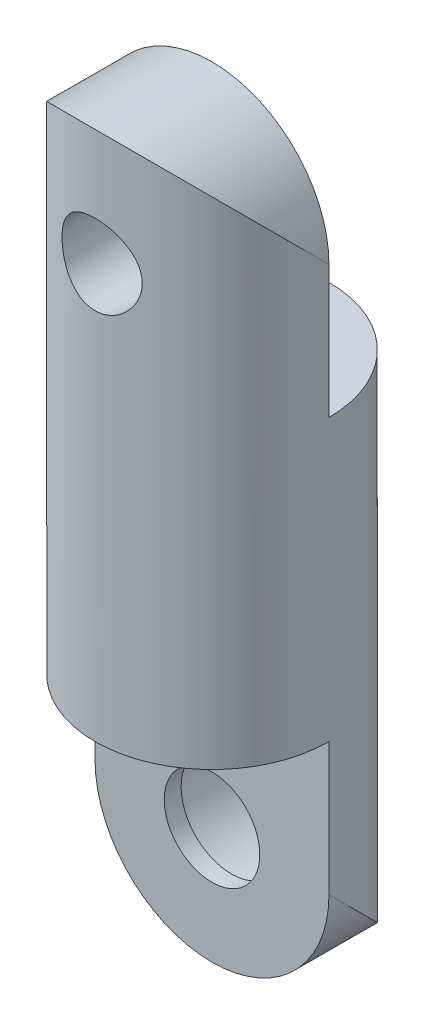
ISO-10303-21;
HEADER;
FILE_DESCRIPTION(('STEP AP214'),'2;1');
FILE_NAME('part.step','',(''),(''),'','','');
FILE_SCHEMA(('AUTOMOTIVE_DESIGN { 1 0 10303 214 1 1 1 1 }'));
ENDSEC;
DATA;
#1=APPLICATION_CONTEXT('core data for automotive mechanical design processes');
#2=APPLICATION_PROTOCOL_DEFINITION('international standard','automotive_design',2000,#1);
#3=PRODUCT_CONTEXT('',#1,'mechanical');
#4=PRODUCT('Part','Part','',(#3));
#5=PRODUCT_RELATED_PRODUCT_CATEGORY('part','',(#4));
#6=PRODUCT_DEFINITION_FORMATION('','',#4);
#7=PRODUCT_DEFINITION_CONTEXT('part definition',#1,'design');
#8=PRODUCT_DEFINITION('design','',#6,#7);
#9=PRODUCT_DEFINITION_SHAPE('','',#8);
#10=(LENGTH_UNIT() NAMED_UNIT(*) SI_UNIT(.MILLI.,.METRE.));
#11=(NAMED_UNIT(*) PLANE_ANGLE_UNIT() SI_UNIT($,.RADIAN.));
#12=(NAMED_UNIT(*) SI_UNIT($,.STERADIAN.) SOLID_ANGLE_UNIT());
#13=UNCERTAINTY_MEASURE_WITH_UNIT(LENGTH_MEASURE(1.E-05),#10,'distance_accuracy_value','');
#14=(GEOMETRIC_REPRESENTATION_CONTEXT(3) GLOBAL_UNCERTAINTY_ASSIGNED_CONTEXT((#13)) GLOBAL_UNIT_ASSIGNED_CONTEXT((#10,
#11,#12)) REPRESENTATION_CONTEXT('',''));
#15=CARTESIAN_POINT('',(0.,0.,0.));
#16=DIRECTION('',(0.,0.,1.));
#17=DIRECTION('',(1.,0.,0.));
#18=AXIS2_PLACEMENT_3D('',#15,#16,#17);
#19=CARTESIAN_POINT('',(0.,63.5,0.));
#20=DIRECTION('',(0.,-1.,0.));
#21=DIRECTION('',(0.,0.,-1.));
#22=AXIS2_PLACEMENT_3D('',#19,#20,#21);
#23=CYLINDRICAL_SURFACE('',#22,9.525);
#24=CARTESIAN_POINT('',(0.,15.748,-9.525));
#25=CARTESIAN_POINT('',(-0.156934723514253,15.7479991634072,-9.52499922257834));
#26=CARTESIAN_POINT('',(-0.313882949789862,15.7420549434146,-9.52111264685008));
#27=CARTESIAN_POINT('',(-0.626511887078806,15.7183670297684,-9.50566210750126));
#28=CARTESIAN_POINT('',(-0.782192454489266,15.7006220176155,-9.49409728599254));
#29=CARTESIAN_POINT('',(-1.09112841711444,15.6535880314441,-9.46357052824237));
#30=CARTESIAN_POINT('',(-1.24438273174379,15.6242940563747,-9.44460538747485));
#31=CARTESIAN_POINT('',(-1.54735001257569,15.5545617962245,-9.39972342238864));
#32=CARTESIAN_POINT('',(-1.69706149182668,15.5141189188937,-9.37380373359864));
#33=CARTESIAN_POINT('',(-1.99115851668002,15.4228466257493,-9.31575307878248));
#34=CARTESIAN_POINT('',(-2.13556770280215,15.3720722959157,-9.28365510171462));
#35=CARTESIAN_POINT('',(-2.41911416643429,15.2605780524269,-9.21384129913733));
#36=CARTESIAN_POINT('',(-2.5582493727651,15.199854280282,-9.17612329464337));
#37=CARTESIAN_POINT('',(-2.96661747883622,15.0036839188896,-9.05566937744821));
#38=CARTESIAN_POINT('',(-3.22707711542841,14.8541550100325,-8.96557934290723));
#39=CARTESIAN_POINT('',(-3.74101098240713,14.5084252718518,-8.7643040390996));
#40=CARTESIAN_POINT('',(-3.99209455918022,14.3093736021146,-8.65198648431073));
#41=CARTESIAN_POINT('',(-4.45971210884856,13.8768116079396,-8.42049031056111));
#42=CARTESIAN_POINT('',(-4.67619690492835,13.6432531283996,-8.30130224772298));
#43=CARTESIAN_POINT('',(-4.98763379665094,13.2509500280644,-8.11583243392666));
#44=CARTESIAN_POINT('',(-5.09517945855456,13.1025073409169,-8.04855916261711));
#45=CARTESIAN_POINT('',(-5.29730188736772,12.7957951855643,-7.91699223664089));
#46=CARTESIAN_POINT('',(-5.39187587796315,12.6375236241926,-7.85269922177893));
#47=CARTESIAN_POINT('',(-5.65476266658884,12.1490660983211,-7.6677885451167));
#48=CARTESIAN_POINT('',(-5.80287157488506,11.8044473666475,-7.55474413148604));
#49=CARTESIAN_POINT('',(-6.003729361554,11.1848899134288,-7.39544695776246));
#50=CARTESIAN_POINT('',(-6.07155948142197,10.9173818806978,-7.33935744261352));
#51=CARTESIAN_POINT('',(-6.14640602970258,10.5082002237448,-7.27655902492335));
#52=CARTESIAN_POINT('',(-6.16686933883874,10.3705354391371,-7.25918452212745));
#53=CARTESIAN_POINT('',(-6.19855823203498,10.0933658972965,-7.23214740414273));
#54=CARTESIAN_POINT('',(-6.20978373836908,9.95386112459224,-7.22248485384154));
#55=CARTESIAN_POINT('',(-6.22281358066484,9.6735816739705,-7.21126115622188));
#56=CARTESIAN_POINT('',(-6.22458381851484,9.53280423136082,-7.2097293304955));
#57=CARTESIAN_POINT('',(-6.218582125865,9.25160721346345,-7.21490658490873));
#58=CARTESIAN_POINT('',(-6.21081015322907,9.11118763975879,-7.22161570143836));
#59=CARTESIAN_POINT('',(-6.18585381246094,8.83172676173245,-7.24300397972116));
#60=CARTESIAN_POINT('',(-6.16866442297574,8.69268623301748,-7.2576873933215));
#61=CARTESIAN_POINT('',(-6.12516074430469,8.41700998095359,-7.29443831953878));
#62=CARTESIAN_POINT('',(-6.09884263564586,8.28037528939513,-7.31650892283388));
#63=CARTESIAN_POINT('',(-6.0090234539764,7.88539472853199,-7.39075079226822));
#64=CARTESIAN_POINT('',(-5.93364207367259,7.63132282626296,-7.45188520582128));
#65=CARTESIAN_POINT('',(-5.75351807229525,7.13928424065651,-7.59181073881822));
#66=CARTESIAN_POINT('',(-5.64876580153466,6.90132288232583,-7.67060765949803));
#67=CARTESIAN_POINT('',(-5.38894697844086,6.39764157228329,-7.85589207158952));
#68=CARTESIAN_POINT('',(-5.22801895491706,6.13579972155227,-7.96477071879505));
#69=CARTESIAN_POINT('',(-4.96030492720383,5.76408443027462,-8.13216860461249));
#70=CARTESIAN_POINT('',(-4.8665879015454,5.64359264084952,-8.18869829644553));
#71=CARTESIAN_POINT('',(-4.67059269595334,5.40983920481505,-8.30204717623972));
#72=CARTESIAN_POINT('',(-4.56831295419478,5.29657888388298,-8.35886641523109));
#73=CARTESIAN_POINT('',(-4.33431796121556,5.0558925588467,-8.48293388471725));
#74=CARTESIAN_POINT('',(-4.20079436332762,4.9301298964019,-8.5500085325601));
#75=CARTESIAN_POINT('',(-3.92238178355393,4.69029295007673,-8.68125692561856));
#76=CARTESIAN_POINT('',(-3.77749639493663,4.57621499691339,-8.74543157794393));
#77=CARTESIAN_POINT('',(-3.476945706779,4.36062595944701,-8.86920920198787));
#78=CARTESIAN_POINT('',(-3.32128647989869,4.25910788430185,-8.92881470980483));
#79=CARTESIAN_POINT('',(-2.9998468094302,4.06959602100861,-9.04187737341704));
#80=CARTESIAN_POINT('',(-2.83406919355426,3.98159847833682,-9.09533623503617));
#81=CARTESIAN_POINT('',(-2.52707571081743,3.83619654502143,-9.18475816224489));
#82=CARTESIAN_POINT('',(-2.38748860975379,3.77618382744373,-9.22209023273268));
#83=CARTESIAN_POINT('',(-2.10307959780248,3.6661586493005,-9.29107527665891));
#84=CARTESIAN_POINT('',(-1.95825873724252,3.61614419526599,-9.32272938204914));
#85=CARTESIAN_POINT('',(-1.66425630974918,3.52670246113572,-9.37967379919022));
#86=CARTESIAN_POINT('',(-1.51507751874074,3.48726859769984,-9.40496806747055));
#87=CARTESIAN_POINT('',(-1.21322375881286,3.41944979727924,-9.44864888363074));
#88=CARTESIAN_POINT('',(-1.06054873029968,3.39106504877649,-9.46703531367264));
#89=CARTESIAN_POINT('',(-0.752206719656679,3.34565618297464,-9.49651968044981));
#90=CARTESIAN_POINT('',(-0.596530449282511,3.32867643073834,-9.5075891518324));
#91=CARTESIAN_POINT('',(-0.283982198418896,3.30650929448325,-9.52205082051723));
#92=CARTESIAN_POINT('',(-0.127110217055839,3.30132191908103,-9.52544301220975));
#93=CARTESIAN_POINT('',(0.186554693179844,3.30282004082096,-9.52446424095804));
#94=CARTESIAN_POINT('',(0.343347620850843,3.30950571329838,-9.5200931633697));
#95=CARTESIAN_POINT('',(0.655574782160458,3.33464606771102,-9.50369862566659));
#96=CARTESIAN_POINT('',(0.81100906143466,3.353100352799,-9.49167542358775));
#97=CARTESIAN_POINT('',(1.10978696110037,3.40000768037505,-9.46124347516521));
#98=CARTESIAN_POINT('',(1.25328417438538,3.42777237175916,-9.44327524069039));
#99=CARTESIAN_POINT('',(1.53714631391083,3.49307210485668,-9.40124644909558));
#100=CARTESIAN_POINT('',(1.67751015350809,3.53061048060765,-9.37718381310589));
#101=CARTESIAN_POINT('',(2.09257281861952,3.65725948574795,-9.29655668517181));
#102=CARTESIAN_POINT('',(2.36148550439807,3.76044292128727,-9.23152709523375));
#103=CARTESIAN_POINT('',(2.89592572981145,4.00846930193164,-9.07864724891962));
#104=CARTESIAN_POINT('',(3.15998420424337,4.15566480513633,-8.98954748712567));
#105=CARTESIAN_POINT('',(3.66078347399887,4.48376151478566,-8.79751602422662));
#106=CARTESIAN_POINT('',(3.89750491611729,4.66468636582666,-8.69457463420531));
#107=CARTESIAN_POINT('',(4.37575658416882,5.08702201942434,-8.46517800164368));
#108=CARTESIAN_POINT('',(4.61227834960768,5.33346551310141,-8.33755950294796));
#109=CARTESIAN_POINT('',(5.04270618775703,5.86260620030978,-8.08449193762185));
#110=CARTESIAN_POINT('',(5.23659243080735,6.14532016675214,-7.95904390535376));
#111=CARTESIAN_POINT('',(5.48251234260332,6.5769344374839,-7.78949158768376));
#112=CARTESIAN_POINT('',(5.55346340118557,6.71280031839116,-7.73895284314897));
#113=CARTESIAN_POINT('',(5.68568814627237,6.9907626912447,-7.6423335950049));
#114=CARTESIAN_POINT('',(5.74696096090623,7.13285974305843,-7.59625349319996));
#115=CARTESIAN_POINT('',(5.8591612050354,7.42260531895354,-7.51005076208941));
#116=CARTESIAN_POINT('',(5.91010243428379,7.57024612154742,-7.46992020560436));
#117=CARTESIAN_POINT('',(6.00109370912988,7.87055418064396,-7.39701984391876));
#118=CARTESIAN_POINT('',(6.04115023716843,8.02321838442482,-7.3642456596248));
#119=CARTESIAN_POINT('',(6.10441544426004,8.30855427362356,-7.31184996708317));
#120=CARTESIAN_POINT('',(6.12927748382231,8.4406301164671,-7.29097429331538));
#121=CARTESIAN_POINT('',(6.1704685436298,8.70695991986325,-7.25614733487742));
#122=CARTESIAN_POINT('',(6.1868015634673,8.8412128289953,-7.24219280476563));
#123=CARTESIAN_POINT('',(6.21068888974415,9.11099553814029,-7.22171850788091));
#124=CARTESIAN_POINT('',(6.21824780626955,9.24652462984934,-7.21519483682254));
#125=CARTESIAN_POINT('',(6.2244764624063,9.51794293109051,-7.20982207072236));
#126=CARTESIAN_POINT('',(6.22314602239608,9.65383214784399,-7.21097313075894));
#127=CARTESIAN_POINT('',(6.2116198869265,9.92485755036298,-7.22090466723035));
#128=CARTESIAN_POINT('',(6.201430510117,10.0599942037714,-7.22967970584802));
#129=CARTESIAN_POINT('',(6.17236783299497,10.3286732609273,-7.25450527528981));
#130=CARTESIAN_POINT('',(6.15349159432285,10.4622151095332,-7.2705582678785));
#131=CARTESIAN_POINT('',(6.08419870558419,10.8593062079271,-7.32884125160146));
#132=CARTESIAN_POINT('',(6.02112093431237,11.119253743181,-7.38119233670326));
#133=CARTESIAN_POINT('',(5.84154928037348,11.6971578739273,-7.5245207650111));
#134=CARTESIAN_POINT('',(5.71490118013639,12.01024762999,-7.62228140246597));
#135=CARTESIAN_POINT('',(5.49132415341893,12.4574032297794,-7.78328108871323));
#136=CARTESIAN_POINT('',(5.41109275124016,12.6028535387381,-7.83940920334262));
#137=CARTESIAN_POINT('',(5.23993170400366,12.8859812980571,-7.95483588953277));
#138=CARTESIAN_POINT('',(5.14900268809776,13.0236592048265,-8.01413427453068));
#139=CARTESIAN_POINT('',(4.85772763778388,13.4288440459374,-8.19639625481617));
#140=CARTESIAN_POINT('',(4.6412027838409,13.683905568096,-8.32198473049766));
#141=CARTESIAN_POINT('',(4.28723256887483,14.0386815722786,-8.50665093472441));
#142=CARTESIAN_POINT('',(4.16431383209409,14.1523512144271,-8.56761478184838));
#143=CARTESIAN_POINT('',(3.9089497468848,14.3699943863045,-8.68709226218222));
#144=CARTESIAN_POINT('',(3.77650310418251,14.4739665943089,-8.74560556079425));
#145=CARTESIAN_POINT('',(3.48754174599829,14.6823141604132,-8.8650848522782));
#146=CARTESIAN_POINT('',(3.32997928916285,14.7854886246894,-8.9256185737508));
#147=CARTESIAN_POINT('',(3.00448888489077,14.9779342163925,-9.04037744568854));
#148=CARTESIAN_POINT('',(2.83656593609156,15.0672119764535,-9.09460560253452));
#149=CARTESIAN_POINT('',(2.4915378942848,15.2306422921687,-9.19511308414229));
#150=CARTESIAN_POINT('',(2.31444639282857,15.3048164753821,-9.24140375975161));
#151=CARTESIAN_POINT('',(1.95224287141228,15.4369874383808,-9.32463681876861));
#152=CARTESIAN_POINT('',(1.76713457806167,15.4949916434826,-9.3615834922526));
#153=CARTESIAN_POINT('',(1.45129138700618,15.577843150601,-9.41467765045274));
#154=CARTESIAN_POINT('',(1.32223828919702,15.6073530444036,-9.43369182132388));
#155=CARTESIAN_POINT('',(1.06188320097416,15.6581649848829,-9.46653211186887));
#156=CARTESIAN_POINT('',(0.930581611739006,15.6794684801425,-9.48035914715788));
#157=CARTESIAN_POINT('',(0.666441854626429,15.7136442572467,-9.50258098465364));
#158=CARTESIAN_POINT('',(0.533603840088529,15.7265173732023,-9.51097632427741));
#159=CARTESIAN_POINT('',(0.267180333188428,15.7436944087251,-9.5221853864717));
#160=CARTESIAN_POINT('',(0.133595059144481,15.7480007121729,-9.52500066180187));
#161=CARTESIAN_POINT('',(0.,15.748,-9.525));
#162=B_SPLINE_CURVE_WITH_KNOTS('',3,(#24,#25,#26,#27,#28,#29,#30,#31,#32,#33,#34,#35,#36,#37,
#38,#39,#40,#41,#42,#43,#44,#45,#46,#47,#48,#49,#50,#51,#52,#53,#54,#55,#56,#57,#58,#59,#60,#61,
#62,#63,#64,#65,#66,#67,#68,#69,#70,#71,#72,#73,#74,#75,#76,#77,#78,#79,#80,#81,#82,#83,#84,#85,
#86,#87,#88,#89,#90,#91,#92,#93,#94,#95,#96,#97,#98,#99,#100,#101,#102,#103,#104,#105,#106,#107,
#108,#109,#110,#111,#112,#113,#114,#115,#116,#117,#118,#119,#120,#121,#122,#123,#124,#125,#126,
#127,#128,#129,#130,#131,#132,#133,#134,#135,#136,#137,#138,#139,#140,#141,#142,#143,#144,#145,
#146,#147,#148,#149,#150,#151,#152,#153,#154,#155,#156,#157,#158,#159,#160,#161),.UNSPECIFIED.,
.T.,.F.,(4,2,2,2,2,2,2,2,2,2,2,2,2,2,2,2,2,2,2,2,2,2,2,2,2,2,2,2,2,2,2,2,2,2,2,2,2,2,2,2,2,2,2,
2,2,2,2,2,2,2,2,2,2,2,2,2,2,2,2,2,2,2,2,2,2,2,2,2,4),(0.,0.470668320488249,0.941389237462392,
1.412314215148,1.88343345813752,2.35210364811599,2.82095602498364,3.75782322705801,
4.7727587724545,5.78912430308385,6.3742640093117,6.95952875764173,8.12684234895856,
8.96803851301099,9.38834563256037,9.80865628849637,10.2304816735983,10.6523089213857,
11.0743613060577,11.4965904916622,12.3092164960307,13.1221097988582,14.0965081705638,
14.5845480903587,15.0726772225662,15.6578980946488,16.2429346260618,16.8276440463505,
17.4121908037738,17.8810991507549,18.349913912627,18.8184362936435,19.2869666666262,
19.7573092125287,20.2276521021056,20.6980019375299,21.1683359132111,21.6096052963261,
22.0510254046525,22.9331325951272,23.8751219536231,24.8177741558159,25.9074497599471,
26.997631102191,27.4814437429279,27.9652999434038,28.4485055448273,28.9314227367476,
29.3390146433286,29.7464152420257,30.1536016874222,30.5607963605997,30.9677008396112,
31.3747430566807,32.1890271422335,33.2379347366272,33.7635254600352,34.2890852876547,
35.3563365598052,35.8904660692137,36.4246682724522,37.0173270554468,37.6097021004997,
38.2012228349383,38.7924714916412,39.1933630245558,39.5941837601543,39.9949648321088,
40.3956343633955),.UNSPECIFIED.);
#163=CARTESIAN_POINT('',(0.,15.748,-9.525));
#164=VERTEX_POINT('',#163);
#165=EDGE_CURVE('E12',#164,#164,#162,.T.);
#166=ORIENTED_EDGE('',*,*,#165,.T.);
#167=EDGE_LOOP('',(#166));
#168=FACE_BOUND('',#167,.T.);
#169=CARTESIAN_POINT('',(-3.2639,53.975,8.94832843552359));
#170=CARTESIAN_POINT('',(-3.26390192209392,54.1524569324861,8.94832688524327));
#171=CARTESIAN_POINT('',(-3.24937881737754,54.3299006240182,8.95366487081399));
#172=CARTESIAN_POINT('',(-3.19188040364878,54.6795107641253,8.97432106299892));
#173=CARTESIAN_POINT('',(-3.14890172122583,54.8516765844761,8.98964045290585));
#174=CARTESIAN_POINT('',(-3.03619537112882,55.1856055871242,9.02832486279914));
#175=CARTESIAN_POINT('',(-2.96652255919638,55.3473893135674,9.05167337313669));
#176=CARTESIAN_POINT('',(-2.80259473258307,55.6570269191027,9.10376068028898));
#177=CARTESIAN_POINT('',(-2.70833382598311,55.8048774478789,9.13250076859575));
#178=CARTESIAN_POINT('',(-2.49372776176308,56.0885691342131,9.19346632695508));
#179=CARTESIAN_POINT('',(-2.37253553121975,56.2237502408304,9.22578218560654));
#180=CARTESIAN_POINT('',(-2.10931254035652,56.4723229471419,9.2894963123213));
#181=CARTESIAN_POINT('',(-1.96727822255056,56.5857108193542,9.32089442263697));
#182=CARTESIAN_POINT('',(-1.66153687958692,56.7905123839132,9.38028781108821));
#183=CARTESIAN_POINT('',(-1.49733779688749,56.881228945832,9.40816447644629));
#184=CARTESIAN_POINT('',(-1.15488983926256,57.0334891046247,9.45630446932821));
#185=CARTESIAN_POINT('',(-0.976644997337641,57.095041040283,9.47656997270046));
#186=CARTESIAN_POINT('',(-0.618089881222586,57.1849700997444,9.50656375351611));
#187=CARTESIAN_POINT('',(-0.438094063806775,57.214479144215,9.51665060185648));
#188=CARTESIAN_POINT('',(-0.0754418398923392,57.2430898125159,9.5264263788851));
#189=CARTESIAN_POINT('',(0.107213829231288,57.2421997091455,9.52611813648513));
#190=CARTESIAN_POINT('',(0.461967399913798,57.210742752476,9.51537827743346));
#191=CARTESIAN_POINT('',(0.634189246240995,57.1814065780516,9.50536647957956));
#192=CARTESIAN_POINT('',(0.971098363536487,57.095932873178,9.47687658322366));
#193=CARTESIAN_POINT('',(1.1357851161415,57.0397935018795,9.45839790321792));
#194=CARTESIAN_POINT('',(1.45557161854778,56.9016210910705,9.41452915212825));
#195=CARTESIAN_POINT('',(1.61051178683812,56.8192484703932,9.38904907975741));
#196=CARTESIAN_POINT('',(1.90472521369059,56.6312316615061,9.33381418556181));
#197=CARTESIAN_POINT('',(2.04399392936917,56.5255807514418,9.30405812986618));
#198=CARTESIAN_POINT('',(2.31021964329339,56.2878615468057,9.24165214073475));
#199=CARTESIAN_POINT('',(2.43622396684901,56.1547432401804,9.20893187428512));
#200=CARTESIAN_POINT('',(2.66443976741646,55.8690022491409,9.1455152566568));
#201=CARTESIAN_POINT('',(2.76664713114972,55.7163761998862,9.11481925602652));
#202=CARTESIAN_POINT('',(2.94578935996434,55.3927771783829,9.05852860953376));
#203=CARTESIAN_POINT('',(3.02229888341381,55.221552179127,9.03302233903171));
#204=CARTESIAN_POINT('',(3.14506727396317,54.8675522016895,8.99101978903448));
#205=CARTESIAN_POINT('',(3.19133968815867,54.6847824362026,8.97451947515806));
#206=CARTESIAN_POINT('',(3.25033241443474,54.3221528967951,8.95331815763101));
#207=CARTESIAN_POINT('',(3.26453800992767,54.1425652741673,8.9480953330939));
#208=CARTESIAN_POINT('',(3.26321823747773,53.7835345184041,8.94857749656172));
#209=CARTESIAN_POINT('',(3.24769867061563,53.6040913639119,8.95428035234103));
#210=CARTESIAN_POINT('',(3.18870666423083,53.257376843843,8.97544888820053));
#211=CARTESIAN_POINT('',(3.14629024401065,53.0899007994674,8.9905453557286));
#212=CARTESIAN_POINT('',(3.03598878983948,52.7644850202172,9.028387075909));
#213=CARTESIAN_POINT('',(2.96809908193763,52.6065470416068,9.05113373217216));
#214=CARTESIAN_POINT('',(2.806232583094,52.2989006215979,9.10264272307873));
#215=CARTESIAN_POINT('',(2.71146762984849,52.1496368037343,9.13157905897268));
#216=CARTESIAN_POINT('',(2.49942173166565,51.868594521327,9.19187945874304));
#217=CARTESIAN_POINT('',(2.38213379036712,51.7368215115552,9.22324427517175));
#218=CARTESIAN_POINT('',(2.12123081014066,51.4875081336884,9.28681377160124));
#219=CARTESIAN_POINT('',(1.97657378496873,51.3710448249273,9.31897898220896));
#220=CARTESIAN_POINT('',(1.66897628834612,51.1639632541488,9.3789477656071));
#221=CARTESIAN_POINT('',(1.50603634955776,51.0733442394448,9.40675146541112));
#222=CARTESIAN_POINT('',(1.16718976071572,50.9213189541472,9.45475334400422));
#223=CARTESIAN_POINT('',(0.991368852084314,50.8597367654375,9.47499716427503));
#224=CARTESIAN_POINT('',(0.631030322969986,50.7672897425682,9.50579104295795));
#225=CARTESIAN_POINT('',(0.446516069401645,50.7364131169847,9.51634482238003));
#226=CARTESIAN_POINT('',(0.0838531379473823,50.7073617757778,9.52627292389743));
#227=CARTESIAN_POINT('',(-0.0941588479405356,50.7076447636606,9.52617449877101));
#228=CARTESIAN_POINT('',(-0.447481015760491,50.7370651506328,9.51612384622613));
#229=CARTESIAN_POINT('',(-0.62279143681709,50.7661999808772,9.50617249607011));
#230=CARTESIAN_POINT('',(-0.962650295180398,50.8514579224546,9.47773864941917));
#231=CARTESIAN_POINT('',(-1.12733374911061,50.9070975647973,9.45940920939859));
#232=CARTESIAN_POINT('',(-1.44508228122617,51.0433317328446,9.416108684977));
#233=CARTESIAN_POINT('',(-1.59814521541814,51.1239308497234,9.39113637877225));
#234=CARTESIAN_POINT('',(-1.89469165127553,51.3113337201017,9.33591955308116));
#235=CARTESIAN_POINT('',(-2.03758548967326,51.4190212290559,9.30551001660039));
#236=CARTESIAN_POINT('',(-2.30377295987377,51.6560654728357,9.24321249562421));
#237=CARTESIAN_POINT('',(-2.42706013494829,51.7854293172768,9.21132402854465));
#238=CARTESIAN_POINT('',(-2.65581635379312,52.0686465411284,9.14805756227328));
#239=CARTESIAN_POINT('',(-2.76031892263847,52.223300590048,9.11675732585581));
#240=CARTESIAN_POINT('',(-2.94179821920345,52.5489591833768,9.05983091551393));
#241=CARTESIAN_POINT('',(-3.0187801639719,52.7199606210346,9.03420366651982));
#242=CARTESIAN_POINT('',(-3.14093166273295,53.0689868645911,8.99245579728717));
#243=CARTESIAN_POINT('',(-3.18688555443799,53.2467081451892,8.97610260862493));
#244=CARTESIAN_POINT('',(-3.24836264015053,53.6079592402063,8.95404185946805));
#245=CARTESIAN_POINT('',(-3.26389801230758,53.7914867001875,8.94833003871289));
#246=CARTESIAN_POINT('',(-3.2639,53.975,8.94832843552359));
#247=B_SPLINE_CURVE_WITH_KNOTS('',3,(#169,#170,#171,#172,#173,#174,#175,#176,#177,#178,#179,
#180,#181,#182,#183,#184,#185,#186,#187,#188,#189,#190,#191,#192,#193,#194,#195,#196,#197,#198,
#199,#200,#201,#202,#203,#204,#205,#206,#207,#208,#209,#210,#211,#212,#213,#214,#215,#216,#217,
#218,#219,#220,#221,#222,#223,#224,#225,#226,#227,#228,#229,#230,#231,#232,#233,#234,#235,#236,
#237,#238,#239,#240,#241,#242,#243,#244,#245,#246),.UNSPECIFIED.,.T.,.F.,(4,2,2,2,2,2,2,2,2,2,2,
2,2,2,2,2,2,2,2,2,2,2,2,2,2,2,2,2,2,2,2,2,2,2,2,2,2,2,4),(0.,0.531690399980125,1.0634438431803,
1.59411035758499,2.12490414988681,2.67564370171506,3.22647736754321,3.7925972753515,
4.35855521966389,4.90379564722722,5.44888769468888,5.97140311390652,6.49395442475671,
7.02356549541311,7.55332969781341,8.1093578382152,8.66548201624338,9.23040312324096,
9.79507095546674,10.3329952775597,10.8708146305208,11.3887251179186,11.9067306803171,
12.4418596914919,12.9771552005516,13.5399140522202,14.1026565124838,14.6619443715276,
15.2210173721221,15.7524312062485,16.2837977298077,16.8058226268596,17.3279436049524,
17.8700187674613,18.4122720743376,18.977312237163,19.5422452291912,20.0923017720196,
20.6421380529247),.UNSPECIFIED.);
#248=CARTESIAN_POINT('',(-3.2639,53.975,8.94832843552359));
#249=VERTEX_POINT('',#248);
#250=EDGE_CURVE('E144',#249,#249,#247,.T.);
#251=ORIENTED_EDGE('',*,*,#250,.T.);
#252=EDGE_LOOP('',(#251));
#253=FACE_BOUND('',#252,.T.);
#254=CARTESIAN_POINT('',(0.,53.975,0.));
#255=DIRECTION('',(0.,-0.707106781186547,0.707106781186547));
#256=DIRECTION('',(0.,-0.707106781186547,-0.707106781186547));
#257=AXIS2_PLACEMENT_3D('',#254,#255,#256);
#258=ELLIPSE('',#257,13.4703841816037,9.525);
#259=CARTESIAN_POINT('',(-9.525,53.975,0.));
#260=VERTEX_POINT('',#259);
#261=CARTESIAN_POINT('',(9.525,53.975,0.));
#262=VERTEX_POINT('',#261);
#263=EDGE_CURVE('E91',#260,#262,#258,.F.);
#264=ORIENTED_EDGE('',*,*,#263,.F.);
#265=DIRECTION('',(0.,-1.,0.));
#266=VECTOR('',#265,1.);
#267=CARTESIAN_POINT('',(-9.525,63.5,0.));
#268=LINE('',#267,#266);
#269=CARTESIAN_POINT('',(-9.525,43.18,0.));
#270=VERTEX_POINT('',#269);
#271=EDGE_CURVE('E184',#260,#270,#268,.T.);
#272=ORIENTED_EDGE('',*,*,#271,.T.);
#273=CARTESIAN_POINT('',(0.,43.18,0.));
#274=DIRECTION('',(0.,-1.,0.));
#275=DIRECTION('',(0.,0.,-1.));
#276=AXIS2_PLACEMENT_3D('',#273,#274,#275);
#277=CIRCLE('',#276,9.525);
#278=CARTESIAN_POINT('',(9.525,43.18,0.));
#279=VERTEX_POINT('',#278);
#280=EDGE_CURVE('E191',#270,#279,#277,.T.);
#281=ORIENTED_EDGE('',*,*,#280,.T.);
#282=DIRECTION('',(0.,1.,0.));
#283=VECTOR('',#282,1.);
#284=CARTESIAN_POINT('',(9.525,63.5,0.));
#285=LINE('',#284,#283);
#286=EDGE_CURVE('E98',#279,#262,#285,.T.);
#287=ORIENTED_EDGE('',*,*,#286,.T.);
#288=EDGE_LOOP('',(#264,#272,#281,#287));
#289=FACE_BOUND('',#288,.T.);
#290=DIRECTION('',(0.,1.,0.));
#291=VECTOR('',#290,1.);
#292=CARTESIAN_POINT('',(9.525,0.,0.));
#293=LINE('',#292,#291);
#294=CARTESIAN_POINT('',(9.525,9.525,0.));
#295=VERTEX_POINT('',#294);
#296=CARTESIAN_POINT('',(9.525,20.32,0.));
#297=VERTEX_POINT('',#296);
#298=EDGE_CURVE('E131',#295,#297,#293,.T.);
#299=ORIENTED_EDGE('',*,*,#298,.F.);
#300=CARTESIAN_POINT('',(0.,9.525,0.));
#301=DIRECTION('',(0.,-0.707106781186547,0.707106781186547));
#302=DIRECTION('',(0.,-0.707106781186547,-0.707106781186547));
#303=AXIS2_PLACEMENT_3D('',#300,#301,#302);
#304=ELLIPSE('',#303,13.4703841816037,9.525);
#305=CARTESIAN_POINT('',(-9.525,9.525,0.));
#306=VERTEX_POINT('',#305);
#307=EDGE_CURVE('E118',#306,#295,#304,.T.);
#308=ORIENTED_EDGE('',*,*,#307,.F.);
#309=DIRECTION('',(0.,-1.,0.));
#310=VECTOR('',#309,1.);
#311=CARTESIAN_POINT('',(-9.525,0.,0.));
#312=LINE('',#311,#310);
#313=CARTESIAN_POINT('',(-9.525,20.32,0.));
#314=VERTEX_POINT('',#313);
#315=EDGE_CURVE('E126',#314,#306,#312,.T.);
#316=ORIENTED_EDGE('',*,*,#315,.F.);
#317=CARTESIAN_POINT('',(0.,20.32,0.));
#318=DIRECTION('',(0.,-1.,0.));
#319=DIRECTION('',(0.,0.,-1.));
#320=AXIS2_PLACEMENT_3D('',#317,#318,#319);
#321=CIRCLE('',#320,9.525);
#322=EDGE_CURVE('E85',#297,#314,#321,.T.);
#323=ORIENTED_EDGE('',*,*,#322,.F.);
#324=EDGE_LOOP('',(#299,#308,#316,#323));
#325=FACE_BOUND('',#324,.T.);
#326=ADVANCED_FACE('F73',(#168,#253,#289,#325),#23,.T.);
#327=CARTESIAN_POINT('',(0.,0.,0.));
#328=DIRECTION('',(0.,0.,-1.));
#329=DIRECTION('',(-1.,0.,0.));
#330=AXIS2_PLACEMENT_3D('',#327,#328,#329);
#331=PLANE('',#330);
#332=CARTESIAN_POINT('',(0.,9.525,0.));
#333=DIRECTION('',(0.,0.,-1.));
#334=DIRECTION('',(-1.,0.,0.));
#335=AXIS2_PLACEMENT_3D('',#332,#333,#334);
#336=CIRCLE('',#335,3.89073650574148);
#337=CARTESIAN_POINT('',(-3.89073650574148,9.525,0.));
#338=VERTEX_POINT('',#337);
#339=EDGE_CURVE('E133',#338,#338,#336,.T.);
#340=ORIENTED_EDGE('',*,*,#339,.T.);
#341=EDGE_LOOP('',(#340));
#342=FACE_BOUND('',#341,.T.);
#343=CARTESIAN_POINT('',(0.,9.525,0.));
#344=DIRECTION('',(0.,0.,1.));
#345=DIRECTION('',(1.,0.,0.));
#346=AXIS2_PLACEMENT_3D('',#343,#344,#345);
#347=CIRCLE('',#346,9.525);
#348=EDGE_CURVE('E121',#306,#295,#347,.T.);
#349=ORIENTED_EDGE('',*,*,#348,.T.);
#350=ORIENTED_EDGE('',*,*,#298,.T.);
#351=DIRECTION('',(-1.,0.,0.));
#352=VECTOR('',#351,1.);
#353=CARTESIAN_POINT('',(-9.525,20.32,0.));
#354=LINE('',#353,#352);
#355=EDGE_CURVE('E136',#297,#314,#354,.T.);
#356=ORIENTED_EDGE('',*,*,#355,.T.);
#357=ORIENTED_EDGE('',*,*,#315,.T.);
#358=EDGE_LOOP('',(#349,#350,#356,#357));
#359=FACE_BOUND('',#358,.T.);
#360=ADVANCED_FACE('F129',(#342,#359),#331,.F.);
#361=CARTESIAN_POINT('',(0.,0.,0.));
#362=DIRECTION('',(0.,0.,1.));
#363=DIRECTION('',(1.,0.,0.));
#364=AXIS2_PLACEMENT_3D('',#361,#362,#363);
#365=PLANE('',#364);
#366=CARTESIAN_POINT('',(0.,53.975,0.));
#367=DIRECTION('',(0.,0.,-1.));
#368=DIRECTION('',(-1.,0.,0.));
#369=AXIS2_PLACEMENT_3D('',#366,#367,#368);
#370=CIRCLE('',#369,3.2639);
#371=CARTESIAN_POINT('',(-3.2639,53.975,0.));
#372=VERTEX_POINT('',#371);
#373=EDGE_CURVE('E138',#372,#372,#370,.T.);
#374=ORIENTED_EDGE('',*,*,#373,.F.);
#375=EDGE_LOOP('',(#374));
#376=FACE_BOUND('',#375,.T.);
#377=ORIENTED_EDGE('',*,*,#271,.F.);
#378=CARTESIAN_POINT('',(0.,53.975,0.));
#379=DIRECTION('',(0.,0.,-1.));
#380=DIRECTION('',(-1.,0.,0.));
#381=AXIS2_PLACEMENT_3D('',#378,#379,#380);
#382=CIRCLE('',#381,9.525);
#383=EDGE_CURVE('E151',#260,#262,#382,.T.);
#384=ORIENTED_EDGE('',*,*,#383,.T.);
#385=ORIENTED_EDGE('',*,*,#286,.F.);
#386=DIRECTION('',(1.,0.,0.));
#387=VECTOR('',#386,1.);
#388=CARTESIAN_POINT('',(-9.525,43.18,0.));
#389=LINE('',#388,#387);
#390=EDGE_CURVE('E186',#270,#279,#389,.T.);
#391=ORIENTED_EDGE('',*,*,#390,.F.);
#392=EDGE_LOOP('',(#377,#384,#385,#391));
#393=FACE_BOUND('',#392,.T.);
#394=ADVANCED_FACE('F165',(#376,#393),#365,.F.);
#395=CARTESIAN_POINT('',(-9.525,43.18,-15.748));
#396=DIRECTION('',(0.,-1.,0.));
#397=DIRECTION('',(0.,0.,-1.));
#398=AXIS2_PLACEMENT_3D('',#395,#396,#397);
#399=PLANE('',#398);
#400=ORIENTED_EDGE('',*,*,#390,.T.);
#401=ORIENTED_EDGE('',*,*,#280,.F.);
#402=EDGE_LOOP('',(#400,#401));
#403=FACE_BOUND('',#402,.T.);
#404=ADVANCED_FACE('F164',(#403),#399,.F.);
#405=CARTESIAN_POINT('',(0.,53.975,15.748));
#406=DIRECTION('',(0.,0.,-1.));
#407=DIRECTION('',(-1.,0.,0.));
#408=AXIS2_PLACEMENT_3D('',#405,#406,#407);
#409=CYLINDRICAL_SURFACE('',#408,9.525);
#410=ORIENTED_EDGE('',*,*,#263,.T.);
#411=ORIENTED_EDGE('',*,*,#383,.F.);
#412=EDGE_LOOP('',(#410,#411));
#413=FACE_BOUND('',#412,.T.);
#414=ADVANCED_FACE('F159',(#413),#409,.T.);
#415=CARTESIAN_POINT('',(0.,53.975,0.));
#416=DIRECTION('',(0.,0.,-1.));
#417=DIRECTION('',(-1.,0.,0.));
#418=AXIS2_PLACEMENT_3D('',#415,#416,#417);
#419=CYLINDRICAL_SURFACE('',#418,3.2639);
#420=ORIENTED_EDGE('',*,*,#373,.T.);
#421=EDGE_LOOP('',(#420));
#422=FACE_BOUND('',#421,.T.);
#423=ORIENTED_EDGE('',*,*,#250,.F.);
#424=EDGE_LOOP('',(#423));
#425=FACE_BOUND('',#424,.T.);
#426=ADVANCED_FACE('F153',(#422,#425),#419,.F.);
#427=CARTESIAN_POINT('',(-9.525,20.32,19.05));
#428=DIRECTION('',(0.,-1.,0.));
#429=DIRECTION('',(0.,0.,-1.));
#430=AXIS2_PLACEMENT_3D('',#427,#428,#429);
#431=PLANE('',#430);
#432=ORIENTED_EDGE('',*,*,#322,.T.);
#433=ORIENTED_EDGE('',*,*,#355,.F.);
#434=EDGE_LOOP('',(#432,#433));
#435=FACE_BOUND('',#434,.T.);
#436=ADVANCED_FACE('F158',(#435),#431,.T.);
#437=CARTESIAN_POINT('',(0.,9.525,-19.05));
#438=DIRECTION('',(0.,0.,1.));
#439=DIRECTION('',(1.,0.,0.));
#440=AXIS2_PLACEMENT_3D('',#437,#438,#439);
#441=CYLINDRICAL_SURFACE('',#440,9.525);
#442=ORIENTED_EDGE('',*,*,#307,.T.);
#443=ORIENTED_EDGE('',*,*,#348,.F.);
#444=EDGE_LOOP('',(#442,#443));
#445=FACE_BOUND('',#444,.T.);
#446=ADVANCED_FACE('F120',(#445),#441,.T.);
#447=CARTESIAN_POINT('',(0.,9.525,-9.525));
#448=DIRECTION('',(0.,0.,-1.));
#449=DIRECTION('',(-1.,0.,0.));
#450=AXIS2_PLACEMENT_3D('',#447,#448,#449);
#451=CYLINDRICAL_SURFACE('',#450,6.223);
#452=CARTESIAN_POINT('',(0.,9.525,-1.5875));
#453=DIRECTION('',(0.,0.,-1.));
#454=DIRECTION('',(-1.,0.,0.));
#455=AXIS2_PLACEMENT_3D('',#452,#453,#454);
#456=CIRCLE('',#455,6.223);
#457=CARTESIAN_POINT('',(-6.223,9.525,-1.5875));
#458=VERTEX_POINT('',#457);
#459=EDGE_CURVE('E202',#458,#458,#456,.T.);
#460=ORIENTED_EDGE('',*,*,#459,.F.);
#461=EDGE_LOOP('',(#460));
#462=FACE_BOUND('',#461,.T.);
#463=ORIENTED_EDGE('',*,*,#165,.F.);
#464=EDGE_LOOP('',(#463));
#465=FACE_BOUND('',#464,.T.);
#466=ADVANCED_FACE('F210',(#462,#465),#451,.F.);
#467=CARTESIAN_POINT('',(0.,9.525,-0.127));
#468=DIRECTION('',(0.,0.,-1.));
#469=DIRECTION('',(-1.,0.,0.));
#470=AXIS2_PLACEMENT_3D('',#467,#468,#469);
#471=CONICAL_SURFACE('',#470,4.1021,1.02974425867665);
#472=CARTESIAN_POINT('',(0.,9.525,-0.127));
#473=DIRECTION('',(0.,0.,-1.));
#474=DIRECTION('',(-1.,0.,0.));
#475=AXIS2_PLACEMENT_3D('',#472,#473,#474);
#476=CIRCLE('',#475,4.1021);
#477=CARTESIAN_POINT('',(-4.1021,9.525,-0.127));
#478=VERTEX_POINT('',#477);
#479=EDGE_CURVE('E194',#478,#478,#476,.T.);
#480=ORIENTED_EDGE('',*,*,#479,.T.);
#481=EDGE_LOOP('',(#480));
#482=FACE_BOUND('',#481,.T.);
#483=ORIENTED_EDGE('',*,*,#339,.F.);
#484=EDGE_LOOP('',(#483));
#485=FACE_BOUND('',#484,.T.);
#486=ADVANCED_FACE('F213',(#482,#485),#471,.F.);
#487=CARTESIAN_POINT('',(0.,9.525,-9.525));
#488=DIRECTION('',(0.,0.,-1.));
#489=DIRECTION('',(-1.,0.,0.));
#490=AXIS2_PLACEMENT_3D('',#487,#488,#489);
#491=CYLINDRICAL_SURFACE('',#490,4.1021);
#492=ORIENTED_EDGE('',*,*,#479,.F.);
#493=EDGE_LOOP('',(#492));
#494=FACE_BOUND('',#493,.T.);
#495=CARTESIAN_POINT('',(0.,9.525,-1.5875));
#496=DIRECTION('',(0.,0.,-1.));
#497=DIRECTION('',(-1.,0.,0.));
#498=AXIS2_PLACEMENT_3D('',#495,#496,#497);
#499=CIRCLE('',#498,4.1021);
#500=CARTESIAN_POINT('',(-4.1021,9.525,-1.5875));
#501=VERTEX_POINT('',#500);
#502=EDGE_CURVE('E197',#501,#501,#499,.T.);
#503=ORIENTED_EDGE('',*,*,#502,.T.);
#504=EDGE_LOOP('',(#503));
#505=FACE_BOUND('',#504,.T.);
#506=ADVANCED_FACE('F218',(#494,#505),#491,.F.);
#507=CARTESIAN_POINT('',(4.1021,9.525,-1.5875));
#508=DIRECTION('',(0.,0.,1.));
#509=DIRECTION('',(1.,0.,0.));
#510=AXIS2_PLACEMENT_3D('',#507,#508,#509);
#511=PLANE('',#510);
#512=ORIENTED_EDGE('',*,*,#502,.F.);
#513=EDGE_LOOP('',(#512));
#514=FACE_BOUND('',#513,.T.);
#515=ORIENTED_EDGE('',*,*,#459,.T.);
#516=EDGE_LOOP('',(#515));
#517=FACE_BOUND('',#516,.T.);
#518=ADVANCED_FACE('F208',(#514,#517),#511,.F.);
#519=CLOSED_SHELL('',(#326,#360,#394,#404,#414,#426,#436,#446,#466,#486,#506,#518));
#520=MANIFOLD_SOLID_BREP('B2',#519);
#521=ADVANCED_BREP_SHAPE_REPRESENTATION('',(#18,#520),#14);
#522=SHAPE_DEFINITION_REPRESENTATION(#9,#521);
ENDSEC;
END-ISO-10303-21;
